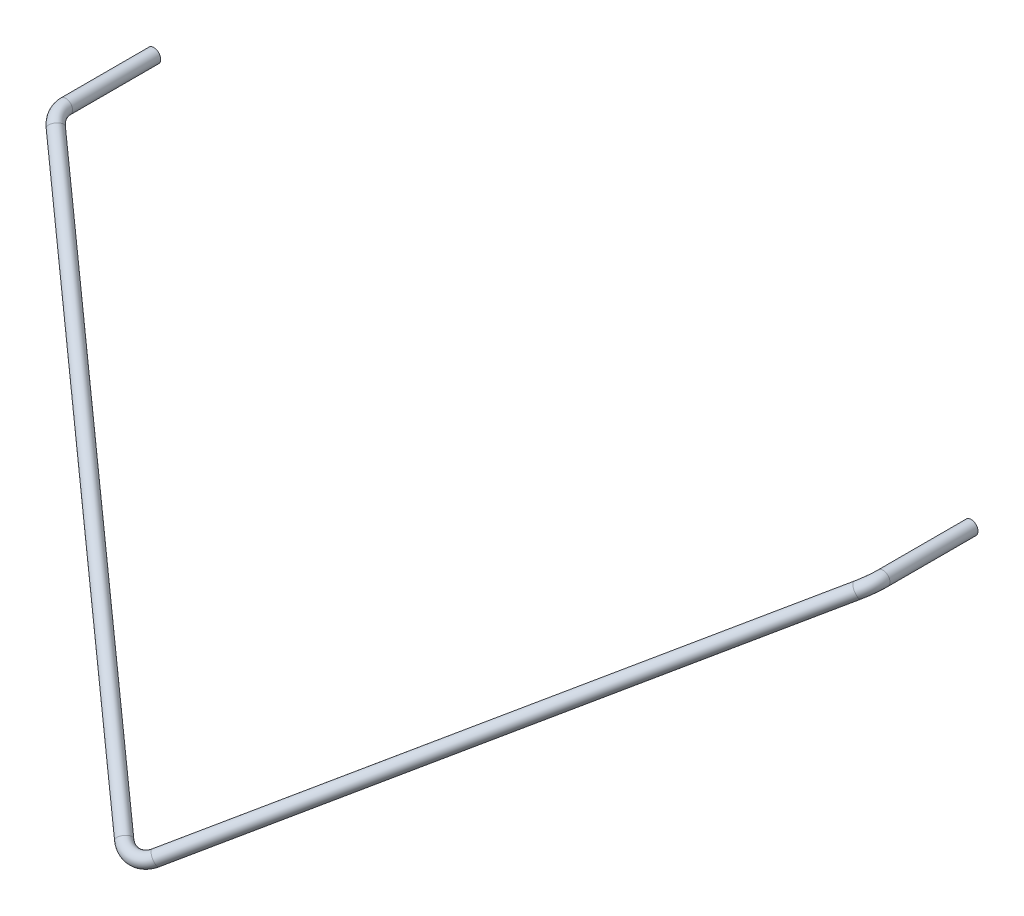
ISO-10303-21;
HEADER;
FILE_DESCRIPTION(('STEP AP214'),'2;1');
FILE_NAME('part.step','',(''),(''),'','','');
FILE_SCHEMA(('AUTOMOTIVE_DESIGN { 1 0 10303 214 1 1 1 1 }'));
ENDSEC;
DATA;
#1=APPLICATION_CONTEXT('core data for automotive mechanical design processes');
#2=APPLICATION_PROTOCOL_DEFINITION('international standard','automotive_design',2000,#1);
#3=PRODUCT_CONTEXT('',#1,'mechanical');
#4=PRODUCT('Part','Part','',(#3));
#5=PRODUCT_RELATED_PRODUCT_CATEGORY('part','',(#4));
#6=PRODUCT_DEFINITION_FORMATION('','',#4);
#7=PRODUCT_DEFINITION_CONTEXT('part definition',#1,'design');
#8=PRODUCT_DEFINITION('design','',#6,#7);
#9=PRODUCT_DEFINITION_SHAPE('','',#8);
#10=(LENGTH_UNIT() NAMED_UNIT(*) SI_UNIT(.MILLI.,.METRE.));
#11=(NAMED_UNIT(*) PLANE_ANGLE_UNIT() SI_UNIT($,.RADIAN.));
#12=(NAMED_UNIT(*) SI_UNIT($,.STERADIAN.) SOLID_ANGLE_UNIT());
#13=UNCERTAINTY_MEASURE_WITH_UNIT(LENGTH_MEASURE(1.E-05),#10,'distance_accuracy_value','');
#14=(GEOMETRIC_REPRESENTATION_CONTEXT(3) GLOBAL_UNCERTAINTY_ASSIGNED_CONTEXT((#13)) GLOBAL_UNIT_ASSIGNED_CONTEXT((#10,
#11,#12)) REPRESENTATION_CONTEXT('',''));
#15=CARTESIAN_POINT('',(0.,0.,0.));
#16=DIRECTION('',(0.,0.,1.));
#17=DIRECTION('',(1.,0.,0.));
#18=AXIS2_PLACEMENT_3D('',#15,#16,#17);
#19=CARTESIAN_POINT('',(-1520.,0.,-370.));
#20=DIRECTION('',(0.,0.,1.));
#21=DIRECTION('',(1.,0.,0.));
#22=AXIS2_PLACEMENT_3D('',#19,#20,#21);
#23=PLANE('',#22);
#24=CARTESIAN_POINT('',(-1520.,0.,-370.));
#25=DIRECTION('',(0.,0.,1.));
#26=DIRECTION('',(1.,0.,0.));
#27=AXIS2_PLACEMENT_3D('',#24,#25,#26);
#28=CIRCLE('',#27,25.4);
#29=CARTESIAN_POINT('',(-1494.6,0.,-370.));
#30=VERTEX_POINT('',#29);
#31=EDGE_CURVE('E44',#30,#30,#28,.T.);
#32=ORIENTED_EDGE('',*,*,#31,.F.);
#33=EDGE_LOOP('',(#32));
#34=FACE_BOUND('',#33,.T.);
#35=ADVANCED_FACE('F32',(#34),#23,.F.);
#36=CARTESIAN_POINT('',(1520.,0.,-370.));
#37=DIRECTION('',(0.,0.,-1.));
#38=DIRECTION('',(-1.,0.,0.));
#39=AXIS2_PLACEMENT_3D('',#36,#37,#38);
#40=PLANE('',#39);
#41=CARTESIAN_POINT('',(1520.,0.,-370.));
#42=DIRECTION('',(0.,0.,-1.));
#43=DIRECTION('',(-1.,0.,0.));
#44=AXIS2_PLACEMENT_3D('',#41,#42,#43);
#45=CIRCLE('',#44,25.4);
#46=CARTESIAN_POINT('',(1494.6,0.,-370.));
#47=VERTEX_POINT('',#46);
#48=EDGE_CURVE('E11',#47,#47,#45,.T.);
#49=ORIENTED_EDGE('',*,*,#48,.T.);
#50=EDGE_LOOP('',(#49));
#51=FACE_BOUND('',#50,.T.);
#52=ADVANCED_FACE('F47',(#51),#40,.T.);
#53=CARTESIAN_POINT('',(-1520.,0.,-370.));
#54=DIRECTION('',(0.,0.,1.));
#55=DIRECTION('',(0.,-1.,0.));
#56=AXIS2_PLACEMENT_3D('',#53,#54,#55);
#57=CYLINDRICAL_SURFACE('',#56,25.4);
#58=CARTESIAN_POINT('',(-1520.,0.,-42.4622091887333));
#59=DIRECTION('',(0.,0.,1.));
#60=DIRECTION('',(1.,0.,0.));
#61=AXIS2_PLACEMENT_3D('',#58,#59,#60);
#62=CIRCLE('',#61,25.4);
#63=CARTESIAN_POINT('',(-1540.89851960161,14.4364773563752,-42.4622091887333));
#64=VERTEX_POINT('',#63);
#65=EDGE_CURVE('E70',#64,#64,#62,.T.);
#66=ORIENTED_EDGE('',*,*,#65,.F.);
#67=EDGE_LOOP('',(#66));
#68=FACE_BOUND('',#67,.T.);
#69=ORIENTED_EDGE('',*,*,#31,.T.);
#70=EDGE_LOOP('',(#69));
#71=FACE_BOUND('',#70,.T.);
#72=ADVANCED_FACE('F74',(#68,#71),#57,.T.);
#73=CARTESIAN_POINT('',(-1454.17789101855,-45.4692200200792,-42.4622091887333));
#74=DIRECTION('',(0.568365250250991,0.8227763622681,0.));
#75=DIRECTION('',(-0.8227763622681,0.568365250250991,0.));
#76=AXIS2_PLACEMENT_3D('',#73,#74,#75);
#77=TOROIDAL_SURFACE('',#76,79.9999999999999,25.4);
#78=CARTESIAN_POINT('',(-1491.06442129594,-19.9883931837272,23.7957061711035));
#79=DIRECTION('',(0.681443082140431,-0.470733708057535,0.560397271497063));
#80=DIRECTION('',(0.702406122671867,0.205574717891145,-0.681443082140431));
#81=AXIS2_PLACEMENT_3D('',#78,#79,#80);
#82=CIRCLE('',#81,25.4);
#83=CARTESIAN_POINT('',(-1502.77589465901,-11.8982306631853,44.8325942978518));
#84=VERTEX_POINT('',#83);
#85=EDGE_CURVE('E67',#84,#84,#82,.T.);
#86=CARTESIAN_POINT('',(-1454.17789101855,-45.4692200200792,-42.4622091887333));
#87=DIRECTION('',(0.568365250250991,0.8227763622681,0.));
#88=DIRECTION('',(-0.8227763622681,0.568365250250991,0.));
#89=AXIS2_PLACEMENT_3D('',#86,#87,#88);
#90=CIRCLE('',#89,105.4);
#91=EDGE_CURVE('',#64,#84,#90,.T.);
#92=ORIENTED_EDGE('',*,*,#65,.T.);
#93=ORIENTED_EDGE('',*,*,#85,.F.);
#94=ORIENTED_EDGE('',*,*,#91,.T.);
#95=ORIENTED_EDGE('',*,*,#91,.F.);
#96=EDGE_LOOP('',(#92,#94,#93,#95));
#97=FACE_BOUND('',#96,.T.);
#98=ADVANCED_FACE('F76',(#97),#77,.T.);
#99=CARTESIAN_POINT('',(-1491.06442129594,-19.9883931837271,23.7957061711038));
#100=DIRECTION('',(0.68144308214043,-0.470733708057534,0.560397271497065));
#101=DIRECTION('',(0.635172769656715,0.,-0.772370087902566));
#102=AXIS2_PLACEMENT_3D('',#99,#100,#101);
#103=CYLINDRICAL_SURFACE('',#102,25.4);
#104=CARTESIAN_POINT('',(-58.5496890268342,-1009.55449113278,1201.85058468188));
#105=DIRECTION('',(0.68144308214043,-0.470733708057534,0.560397271497065));
#106=DIRECTION('',(0.702406122671868,0.205574717891144,-0.68144308214043));
#107=AXIS2_PLACEMENT_3D('',#104,#105,#106);
#108=CIRCLE('',#107,25.4);
#109=CARTESIAN_POINT('',(-77.1392152928539,-1020.68728059641,1215.10390547191));
#110=VERTEX_POINT('',#109);
#111=EDGE_CURVE('E64',#110,#110,#108,.T.);
#112=ORIENTED_EDGE('',*,*,#111,.F.);
#113=EDGE_LOOP('',(#112));
#114=FACE_BOUND('',#113,.T.);
#115=ORIENTED_EDGE('',*,*,#85,.T.);
#116=EDGE_LOOP('',(#115));
#117=FACE_BOUND('',#116,.T.);
#118=ADVANCED_FACE('F83',(#114,#117),#103,.T.);
#119=CARTESIAN_POINT('',(-1.52655665885959E-13,-974.490587310331,1160.10784203611));
#120=DIRECTION('',(0.,0.765704864789611,0.643192086423273));
#121=DIRECTION('',(0.,-0.643192086423274,0.765704864789611));
#122=AXIS2_PLACEMENT_3D('',#119,#120,#121);
#123=TOROIDAL_SURFACE('',#122,80.0000000000001,25.4);
#124=CARTESIAN_POINT('',(58.5496890268333,-1009.55449113278,1201.85058468188));
#125=DIRECTION('',(0.68144308214043,0.470733708057535,-0.560397271497065));
#126=DIRECTION('',(-0.702406122671868,0.205574717891144,-0.68144308214043));
#127=AXIS2_PLACEMENT_3D('',#124,#125,#126);
#128=CIRCLE('',#127,25.4);
#129=CARTESIAN_POINT('',(77.1392152928529,-1020.68728059641,1215.10390547191));
#130=VERTEX_POINT('',#129);
#131=EDGE_CURVE('E59',#130,#130,#128,.T.);
#132=CARTESIAN_POINT('',(-1.52655665885959E-13,-974.490587310331,1160.10784203611));
#133=DIRECTION('',(0.,0.765704864789611,0.643192086423273));
#134=DIRECTION('',(0.,-0.643192086423274,0.765704864789611));
#135=AXIS2_PLACEMENT_3D('',#132,#133,#134);
#136=CIRCLE('',#135,105.4);
#137=EDGE_CURVE('',#110,#130,#136,.T.);
#138=ORIENTED_EDGE('',*,*,#111,.T.);
#139=ORIENTED_EDGE('',*,*,#131,.F.);
#140=ORIENTED_EDGE('',*,*,#137,.T.);
#141=ORIENTED_EDGE('',*,*,#137,.F.);
#142=EDGE_LOOP('',(#138,#140,#139,#141));
#143=FACE_BOUND('',#142,.T.);
#144=ADVANCED_FACE('F90',(#143),#123,.T.);
#145=CARTESIAN_POINT('',(58.5496890268332,-1009.55449113278,1201.85058468188));
#146=DIRECTION('',(0.68144308214043,0.470733708057534,-0.560397271497064));
#147=DIRECTION('',(-0.635172769656715,0.,-0.772370087902566));
#148=AXIS2_PLACEMENT_3D('',#145,#146,#147);
#149=CYLINDRICAL_SURFACE('',#148,25.4);
#150=CARTESIAN_POINT('',(1491.06442129594,-19.9883931837273,23.7957061711036));
#151=DIRECTION('',(0.68144308214043,0.470733708057534,-0.560397271497064));
#152=DIRECTION('',(-0.702406122671868,0.205574717891144,-0.68144308214043));
#153=AXIS2_PLACEMENT_3D('',#150,#151,#152);
#154=CIRCLE('',#153,25.4);
#155=CARTESIAN_POINT('',(1502.77589465901,-11.8982306631857,44.8325942978517));
#156=VERTEX_POINT('',#155);
#157=EDGE_CURVE('E57',#156,#156,#154,.T.);
#158=ORIENTED_EDGE('',*,*,#157,.F.);
#159=EDGE_LOOP('',(#158));
#160=FACE_BOUND('',#159,.T.);
#161=ORIENTED_EDGE('',*,*,#131,.T.);
#162=EDGE_LOOP('',(#161));
#163=FACE_BOUND('',#162,.T.);
#164=ADVANCED_FACE('F94',(#160,#163),#149,.T.);
#165=CARTESIAN_POINT('',(1454.17789101855,-45.4692200200792,-42.4622091887339));
#166=DIRECTION('',(-0.568365250250989,0.822776362268102,0.));
#167=DIRECTION('',(-0.822776362268102,-0.568365250250989,0.));
#168=AXIS2_PLACEMENT_3D('',#165,#166,#167);
#169=TOROIDAL_SURFACE('',#168,80.0000000000002,25.4);
#170=CARTESIAN_POINT('',(1520.,0.,-42.4622091887339));
#171=DIRECTION('',(0.,0.,-1.));
#172=DIRECTION('',(-1.,0.,0.));
#173=AXIS2_PLACEMENT_3D('',#170,#171,#172);
#174=CIRCLE('',#173,25.4);
#175=CARTESIAN_POINT('',(1540.89851960161,14.4364773563752,-42.4622091887339));
#176=VERTEX_POINT('',#175);
#177=EDGE_CURVE('E39',#176,#176,#174,.T.);
#178=CARTESIAN_POINT('',(1454.17789101855,-45.4692200200792,-42.4622091887339));
#179=DIRECTION('',(-0.568365250250989,0.822776362268102,0.));
#180=DIRECTION('',(-0.822776362268102,-0.568365250250989,0.));
#181=AXIS2_PLACEMENT_3D('',#178,#179,#180);
#182=CIRCLE('',#181,105.4);
#183=EDGE_CURVE('',#156,#176,#182,.T.);
#184=ORIENTED_EDGE('',*,*,#157,.T.);
#185=ORIENTED_EDGE('',*,*,#177,.F.);
#186=ORIENTED_EDGE('',*,*,#183,.T.);
#187=ORIENTED_EDGE('',*,*,#183,.F.);
#188=EDGE_LOOP('',(#184,#186,#185,#187));
#189=FACE_BOUND('',#188,.T.);
#190=ADVANCED_FACE('F52',(#189),#169,.T.);
#191=CARTESIAN_POINT('',(1520.,0.,-42.4622091887339));
#192=DIRECTION('',(0.,0.,-1.));
#193=DIRECTION('',(0.,1.,0.));
#194=AXIS2_PLACEMENT_3D('',#191,#192,#193);
#195=CYLINDRICAL_SURFACE('',#194,25.4);
#196=ORIENTED_EDGE('',*,*,#48,.F.);
#197=EDGE_LOOP('',(#196));
#198=FACE_BOUND('',#197,.T.);
#199=ORIENTED_EDGE('',*,*,#177,.T.);
#200=EDGE_LOOP('',(#199));
#201=FACE_BOUND('',#200,.T.);
#202=ADVANCED_FACE('F49',(#198,#201),#195,.T.);
#203=CLOSED_SHELL('',(#35,#52,#72,#98,#118,#144,#164,#190,#202));
#204=MANIFOLD_SOLID_BREP('B2',#203);
#205=ADVANCED_BREP_SHAPE_REPRESENTATION('',(#18,#204),#14);
#206=SHAPE_DEFINITION_REPRESENTATION(#9,#205);
ENDSEC;
END-ISO-10303-21;
